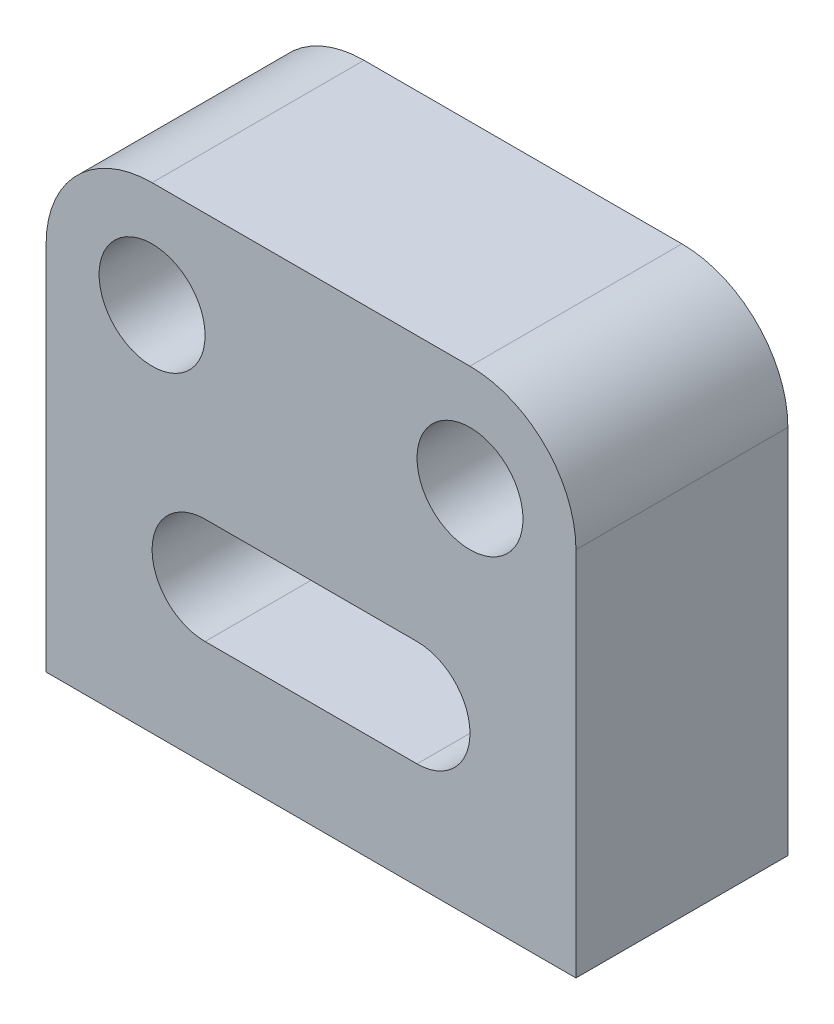
ISO-10303-21;
HEADER;
FILE_DESCRIPTION(('STEP AP214'),'2;1');
FILE_NAME('part.step','',(''),(''),'','','');
FILE_SCHEMA(('AUTOMOTIVE_DESIGN { 1 0 10303 214 1 1 1 1 }'));
ENDSEC;
DATA;
#1=APPLICATION_CONTEXT('core data for automotive mechanical design processes');
#2=APPLICATION_PROTOCOL_DEFINITION('international standard','automotive_design',2000,#1);
#3=PRODUCT_CONTEXT('',#1,'mechanical');
#4=PRODUCT('Part','Part','',(#3));
#5=PRODUCT_RELATED_PRODUCT_CATEGORY('part','',(#4));
#6=PRODUCT_DEFINITION_FORMATION('','',#4);
#7=PRODUCT_DEFINITION_CONTEXT('part definition',#1,'design');
#8=PRODUCT_DEFINITION('design','',#6,#7);
#9=PRODUCT_DEFINITION_SHAPE('','',#8);
#10=(LENGTH_UNIT() NAMED_UNIT(*) SI_UNIT(.MILLI.,.METRE.));
#11=(NAMED_UNIT(*) PLANE_ANGLE_UNIT() SI_UNIT($,.RADIAN.));
#12=(NAMED_UNIT(*) SI_UNIT($,.STERADIAN.) SOLID_ANGLE_UNIT());
#13=UNCERTAINTY_MEASURE_WITH_UNIT(LENGTH_MEASURE(1.E-05),#10,'distance_accuracy_value','');
#14=(GEOMETRIC_REPRESENTATION_CONTEXT(3) GLOBAL_UNCERTAINTY_ASSIGNED_CONTEXT((#13)) GLOBAL_UNIT_ASSIGNED_CONTEXT((#10,
#11,#12)) REPRESENTATION_CONTEXT('',''));
#15=CARTESIAN_POINT('',(0.,0.,0.));
#16=DIRECTION('',(0.,0.,1.));
#17=DIRECTION('',(1.,0.,0.));
#18=AXIS2_PLACEMENT_3D('',#15,#16,#17);
#19=CARTESIAN_POINT('',(-30.,70.,40.));
#20=DIRECTION('',(0.,0.,-1.));
#21=DIRECTION('',(-1.,0.,0.));
#22=AXIS2_PLACEMENT_3D('',#19,#20,#21);
#23=PLANE('',#22);
#24=CARTESIAN_POINT('',(30.,69.9999999999999,40.));
#25=DIRECTION('',(0.,0.,1.));
#26=DIRECTION('',(-1.,0.,0.));
#27=AXIS2_PLACEMENT_3D('',#24,#25,#26);
#28=CIRCLE('',#27,10.);
#29=CARTESIAN_POINT('',(20.,69.9999999999999,40.));
#30=VERTEX_POINT('',#29);
#31=EDGE_CURVE('E152',#30,#30,#28,.T.);
#32=ORIENTED_EDGE('',*,*,#31,.F.);
#33=EDGE_LOOP('',(#32));
#34=FACE_BOUND('',#33,.T.);
#35=CARTESIAN_POINT('',(-30.,70.,40.));
#36=DIRECTION('',(0.,0.,1.));
#37=DIRECTION('',(1.,0.,0.));
#38=AXIS2_PLACEMENT_3D('',#35,#36,#37);
#39=CIRCLE('',#38,10.);
#40=CARTESIAN_POINT('',(-20.,70.,40.));
#41=VERTEX_POINT('',#40);
#42=EDGE_CURVE('E158',#41,#41,#39,.T.);
#43=ORIENTED_EDGE('',*,*,#42,.F.);
#44=EDGE_LOOP('',(#43));
#45=FACE_BOUND('',#44,.T.);
#46=DIRECTION('',(0.,-1.,0.));
#47=VECTOR('',#46,1.);
#48=CARTESIAN_POINT('',(-50.,0.,40.));
#49=LINE('',#48,#47);
#50=CARTESIAN_POINT('',(-50.,70.,40.));
#51=VERTEX_POINT('',#50);
#52=CARTESIAN_POINT('',(-50.,0.,40.));
#53=VERTEX_POINT('',#52);
#54=EDGE_CURVE('E164',#51,#53,#49,.T.);
#55=ORIENTED_EDGE('',*,*,#54,.T.);
#56=DIRECTION('',(1.,0.,0.));
#57=VECTOR('',#56,1.);
#58=CARTESIAN_POINT('',(50.,0.,40.));
#59=LINE('',#58,#57);
#60=CARTESIAN_POINT('',(50.,0.,40.));
#61=VERTEX_POINT('',#60);
#62=EDGE_CURVE('E167',#53,#61,#59,.T.);
#63=ORIENTED_EDGE('',*,*,#62,.T.);
#64=DIRECTION('',(0.,1.,0.));
#65=VECTOR('',#64,1.);
#66=CARTESIAN_POINT('',(50.,0.,40.));
#67=LINE('',#66,#65);
#68=CARTESIAN_POINT('',(50.,69.9999999999999,40.));
#69=VERTEX_POINT('',#68);
#70=EDGE_CURVE('E170',#61,#69,#67,.T.);
#71=ORIENTED_EDGE('',*,*,#70,.T.);
#72=CARTESIAN_POINT('',(30.,69.9999999999999,40.));
#73=DIRECTION('',(0.,0.,1.));
#74=DIRECTION('',(1.,0.,0.));
#75=AXIS2_PLACEMENT_3D('',#72,#73,#74);
#76=CIRCLE('',#75,20.);
#77=CARTESIAN_POINT('',(30.,89.9999999999999,40.));
#78=VERTEX_POINT('',#77);
#79=EDGE_CURVE('E172',#69,#78,#76,.T.);
#80=ORIENTED_EDGE('',*,*,#79,.T.);
#81=DIRECTION('',(-1.,0.,0.));
#82=VECTOR('',#81,1.);
#83=CARTESIAN_POINT('',(-30.,90.,40.));
#84=LINE('',#83,#82);
#85=CARTESIAN_POINT('',(-30.,90.,40.));
#86=VERTEX_POINT('',#85);
#87=EDGE_CURVE('E174',#78,#86,#84,.T.);
#88=ORIENTED_EDGE('',*,*,#87,.T.);
#89=CARTESIAN_POINT('',(-30.,70.,40.));
#90=DIRECTION('',(0.,0.,1.));
#91=DIRECTION('',(-1.,0.,0.));
#92=AXIS2_PLACEMENT_3D('',#89,#90,#91);
#93=CIRCLE('',#92,20.);
#94=EDGE_CURVE('E176',#86,#51,#93,.T.);
#95=ORIENTED_EDGE('',*,*,#94,.T.);
#96=EDGE_LOOP('',(#55,#63,#71,#80,#88,#95));
#97=FACE_BOUND('',#96,.T.);
#98=CARTESIAN_POINT('',(-20.,30.,40.));
#99=DIRECTION('',(0.,0.,1.));
#100=DIRECTION('',(1.,0.,0.));
#101=AXIS2_PLACEMENT_3D('',#98,#99,#100);
#102=CIRCLE('',#101,10.);
#103=CARTESIAN_POINT('',(-20.,40.,40.));
#104=VERTEX_POINT('',#103);
#105=CARTESIAN_POINT('',(-20.,20.,40.));
#106=VERTEX_POINT('',#105);
#107=EDGE_CURVE('E116',#104,#106,#102,.T.);
#108=ORIENTED_EDGE('',*,*,#107,.F.);
#109=DIRECTION('',(-1.,0.,0.));
#110=VECTOR('',#109,1.);
#111=CARTESIAN_POINT('',(-20.,40.,40.));
#112=LINE('',#111,#110);
#113=CARTESIAN_POINT('',(20.,40.,40.));
#114=VERTEX_POINT('',#113);
#115=EDGE_CURVE('E138',#114,#104,#112,.T.);
#116=ORIENTED_EDGE('',*,*,#115,.F.);
#117=CARTESIAN_POINT('',(20.,30.,40.));
#118=DIRECTION('',(0.,0.,1.));
#119=DIRECTION('',(1.,0.,0.));
#120=AXIS2_PLACEMENT_3D('',#117,#118,#119);
#121=CIRCLE('',#120,10.);
#122=CARTESIAN_POINT('',(20.,20.,40.));
#123=VERTEX_POINT('',#122);
#124=EDGE_CURVE('E136',#123,#114,#121,.T.);
#125=ORIENTED_EDGE('',*,*,#124,.F.);
#126=DIRECTION('',(1.,0.,0.));
#127=VECTOR('',#126,1.);
#128=CARTESIAN_POINT('',(-20.,20.,40.));
#129=LINE('',#128,#127);
#130=EDGE_CURVE('E124',#106,#123,#129,.T.);
#131=ORIENTED_EDGE('',*,*,#130,.F.);
#132=EDGE_LOOP('',(#108,#116,#125,#131));
#133=FACE_BOUND('',#132,.T.);
#134=ADVANCED_FACE('F39',(#34,#45,#97,#133),#23,.F.);
#135=CARTESIAN_POINT('',(-30.,70.,0.));
#136=DIRECTION('',(0.,0.,-1.));
#137=DIRECTION('',(-1.,0.,0.));
#138=AXIS2_PLACEMENT_3D('',#135,#136,#137);
#139=PLANE('',#138);
#140=CARTESIAN_POINT('',(-30.,70.,0.));
#141=DIRECTION('',(0.,0.,1.));
#142=DIRECTION('',(1.,0.,0.));
#143=AXIS2_PLACEMENT_3D('',#140,#141,#142);
#144=CIRCLE('',#143,10.);
#145=CARTESIAN_POINT('',(-20.,70.,0.));
#146=VERTEX_POINT('',#145);
#147=EDGE_CURVE('E155',#146,#146,#144,.T.);
#148=ORIENTED_EDGE('',*,*,#147,.T.);
#149=EDGE_LOOP('',(#148));
#150=FACE_BOUND('',#149,.T.);
#151=DIRECTION('',(0.,-1.,0.));
#152=VECTOR('',#151,1.);
#153=CARTESIAN_POINT('',(-50.,0.,0.));
#154=LINE('',#153,#152);
#155=CARTESIAN_POINT('',(-50.,70.,0.));
#156=VERTEX_POINT('',#155);
#157=CARTESIAN_POINT('',(-50.,0.,0.));
#158=VERTEX_POINT('',#157);
#159=EDGE_CURVE('E161',#156,#158,#154,.T.);
#160=ORIENTED_EDGE('',*,*,#159,.F.);
#161=CARTESIAN_POINT('',(-30.,70.,0.));
#162=DIRECTION('',(0.,0.,1.));
#163=DIRECTION('',(-1.,0.,0.));
#164=AXIS2_PLACEMENT_3D('',#161,#162,#163);
#165=CIRCLE('',#164,20.);
#166=CARTESIAN_POINT('',(-30.,90.,0.));
#167=VERTEX_POINT('',#166);
#168=EDGE_CURVE('E168',#167,#156,#165,.T.);
#169=ORIENTED_EDGE('',*,*,#168,.F.);
#170=DIRECTION('',(-1.,0.,0.));
#171=VECTOR('',#170,1.);
#172=CARTESIAN_POINT('',(-30.,90.,0.));
#173=LINE('',#172,#171);
#174=CARTESIAN_POINT('',(30.,89.9999999999999,0.));
#175=VERTEX_POINT('',#174);
#176=EDGE_CURVE('E187',#175,#167,#173,.T.);
#177=ORIENTED_EDGE('',*,*,#176,.F.);
#178=CARTESIAN_POINT('',(30.,69.9999999999999,0.));
#179=DIRECTION('',(0.,0.,1.));
#180=DIRECTION('',(1.,0.,0.));
#181=AXIS2_PLACEMENT_3D('',#178,#179,#180);
#182=CIRCLE('',#181,20.);
#183=CARTESIAN_POINT('',(50.,69.9999999999999,0.));
#184=VERTEX_POINT('',#183);
#185=EDGE_CURVE('E185',#184,#175,#182,.T.);
#186=ORIENTED_EDGE('',*,*,#185,.F.);
#187=DIRECTION('',(0.,1.,0.));
#188=VECTOR('',#187,1.);
#189=CARTESIAN_POINT('',(50.,0.,0.));
#190=LINE('',#189,#188);
#191=CARTESIAN_POINT('',(50.,0.,0.));
#192=VERTEX_POINT('',#191);
#193=EDGE_CURVE('E183',#192,#184,#190,.T.);
#194=ORIENTED_EDGE('',*,*,#193,.F.);
#195=DIRECTION('',(1.,0.,0.));
#196=VECTOR('',#195,1.);
#197=CARTESIAN_POINT('',(50.,0.,0.));
#198=LINE('',#197,#196);
#199=EDGE_CURVE('E181',#158,#192,#198,.T.);
#200=ORIENTED_EDGE('',*,*,#199,.F.);
#201=EDGE_LOOP('',(#160,#169,#177,#186,#194,#200));
#202=FACE_BOUND('',#201,.T.);
#203=CARTESIAN_POINT('',(30.,69.9999999999999,0.));
#204=DIRECTION('',(0.,0.,1.));
#205=DIRECTION('',(-1.,0.,0.));
#206=AXIS2_PLACEMENT_3D('',#203,#204,#205);
#207=CIRCLE('',#206,10.);
#208=CARTESIAN_POINT('',(20.,69.9999999999999,0.));
#209=VERTEX_POINT('',#208);
#210=EDGE_CURVE('E132',#209,#209,#207,.T.);
#211=ORIENTED_EDGE('',*,*,#210,.T.);
#212=EDGE_LOOP('',(#211));
#213=FACE_BOUND('',#212,.T.);
#214=DIRECTION('',(-1.,0.,0.));
#215=VECTOR('',#214,1.);
#216=CARTESIAN_POINT('',(-20.,40.,0.));
#217=LINE('',#216,#215);
#218=CARTESIAN_POINT('',(20.,40.,0.));
#219=VERTEX_POINT('',#218);
#220=CARTESIAN_POINT('',(-20.,40.,0.));
#221=VERTEX_POINT('',#220);
#222=EDGE_CURVE('E125',#219,#221,#217,.T.);
#223=ORIENTED_EDGE('',*,*,#222,.T.);
#224=CARTESIAN_POINT('',(-20.,30.,0.));
#225=DIRECTION('',(0.,0.,1.));
#226=DIRECTION('',(1.,0.,0.));
#227=AXIS2_PLACEMENT_3D('',#224,#225,#226);
#228=CIRCLE('',#227,10.);
#229=CARTESIAN_POINT('',(-20.,20.,0.));
#230=VERTEX_POINT('',#229);
#231=EDGE_CURVE('E62',#221,#230,#228,.T.);
#232=ORIENTED_EDGE('',*,*,#231,.T.);
#233=DIRECTION('',(1.,0.,0.));
#234=VECTOR('',#233,1.);
#235=CARTESIAN_POINT('',(-20.,20.,0.));
#236=LINE('',#235,#234);
#237=CARTESIAN_POINT('',(20.,20.,0.));
#238=VERTEX_POINT('',#237);
#239=EDGE_CURVE('E131',#230,#238,#236,.T.);
#240=ORIENTED_EDGE('',*,*,#239,.T.);
#241=CARTESIAN_POINT('',(20.,30.,0.));
#242=DIRECTION('',(0.,0.,1.));
#243=DIRECTION('',(1.,0.,0.));
#244=AXIS2_PLACEMENT_3D('',#241,#242,#243);
#245=CIRCLE('',#244,10.);
#246=EDGE_CURVE('E144',#238,#219,#245,.T.);
#247=ORIENTED_EDGE('',*,*,#246,.T.);
#248=EDGE_LOOP('',(#223,#232,#240,#247));
#249=FACE_BOUND('',#248,.T.);
#250=ADVANCED_FACE('F211',(#150,#202,#213,#249),#139,.T.);
#251=CARTESIAN_POINT('',(-50.,0.,40.));
#252=DIRECTION('',(1.,0.,0.));
#253=DIRECTION('',(0.,0.,-1.));
#254=AXIS2_PLACEMENT_3D('',#251,#252,#253);
#255=PLANE('',#254);
#256=ORIENTED_EDGE('',*,*,#159,.T.);
#257=DIRECTION('',(0.,0.,-1.));
#258=VECTOR('',#257,1.);
#259=CARTESIAN_POINT('',(-50.,0.,40.));
#260=LINE('',#259,#258);
#261=EDGE_CURVE('E11',#53,#158,#260,.T.);
#262=ORIENTED_EDGE('',*,*,#261,.F.);
#263=ORIENTED_EDGE('',*,*,#54,.F.);
#264=DIRECTION('',(0.,0.,-1.));
#265=VECTOR('',#264,1.);
#266=CARTESIAN_POINT('',(-50.,70.,40.));
#267=LINE('',#266,#265);
#268=EDGE_CURVE('E178',#51,#156,#267,.T.);
#269=ORIENTED_EDGE('',*,*,#268,.T.);
#270=EDGE_LOOP('',(#256,#262,#263,#269));
#271=FACE_BOUND('',#270,.T.);
#272=ADVANCED_FACE('F41',(#271),#255,.F.);
#273=CARTESIAN_POINT('',(50.,0.,40.));
#274=DIRECTION('',(0.,1.,0.));
#275=DIRECTION('',(-1.,0.,0.));
#276=AXIS2_PLACEMENT_3D('',#273,#274,#275);
#277=PLANE('',#276);
#278=ORIENTED_EDGE('',*,*,#199,.T.);
#279=DIRECTION('',(0.,0.,-1.));
#280=VECTOR('',#279,1.);
#281=CARTESIAN_POINT('',(50.,0.,40.));
#282=LINE('',#281,#280);
#283=EDGE_CURVE('E47',#61,#192,#282,.T.);
#284=ORIENTED_EDGE('',*,*,#283,.F.);
#285=ORIENTED_EDGE('',*,*,#62,.F.);
#286=ORIENTED_EDGE('',*,*,#261,.T.);
#287=EDGE_LOOP('',(#278,#284,#285,#286));
#288=FACE_BOUND('',#287,.T.);
#289=ADVANCED_FACE('F228',(#288),#277,.F.);
#290=CARTESIAN_POINT('',(50.,0.,40.));
#291=DIRECTION('',(-1.,0.,0.));
#292=DIRECTION('',(0.,0.,1.));
#293=AXIS2_PLACEMENT_3D('',#290,#291,#292);
#294=PLANE('',#293);
#295=ORIENTED_EDGE('',*,*,#193,.T.);
#296=DIRECTION('',(0.,0.,-1.));
#297=VECTOR('',#296,1.);
#298=CARTESIAN_POINT('',(50.,69.9999999999999,40.));
#299=LINE('',#298,#297);
#300=EDGE_CURVE('E198',#69,#184,#299,.T.);
#301=ORIENTED_EDGE('',*,*,#300,.F.);
#302=ORIENTED_EDGE('',*,*,#70,.F.);
#303=ORIENTED_EDGE('',*,*,#283,.T.);
#304=EDGE_LOOP('',(#295,#301,#302,#303));
#305=FACE_BOUND('',#304,.T.);
#306=ADVANCED_FACE('F205',(#305),#294,.F.);
#307=CARTESIAN_POINT('',(30.,69.9999999999999,40.));
#308=DIRECTION('',(0.,0.,-1.));
#309=DIRECTION('',(-1.,0.,0.));
#310=AXIS2_PLACEMENT_3D('',#307,#308,#309);
#311=CYLINDRICAL_SURFACE('',#310,20.);
#312=ORIENTED_EDGE('',*,*,#185,.T.);
#313=DIRECTION('',(0.,0.,-1.));
#314=VECTOR('',#313,1.);
#315=CARTESIAN_POINT('',(30.,89.9999999999999,40.));
#316=LINE('',#315,#314);
#317=EDGE_CURVE('E195',#78,#175,#316,.T.);
#318=ORIENTED_EDGE('',*,*,#317,.F.);
#319=ORIENTED_EDGE('',*,*,#79,.F.);
#320=ORIENTED_EDGE('',*,*,#300,.T.);
#321=EDGE_LOOP('',(#312,#318,#319,#320));
#322=FACE_BOUND('',#321,.T.);
#323=ADVANCED_FACE('F217',(#322),#311,.T.);
#324=CARTESIAN_POINT('',(-30.,90.,40.));
#325=DIRECTION('',(0.,-1.,0.));
#326=DIRECTION('',(1.,0.,0.));
#327=AXIS2_PLACEMENT_3D('',#324,#325,#326);
#328=PLANE('',#327);
#329=ORIENTED_EDGE('',*,*,#176,.T.);
#330=DIRECTION('',(0.,0.,-1.));
#331=VECTOR('',#330,1.);
#332=CARTESIAN_POINT('',(-30.,90.,40.));
#333=LINE('',#332,#331);
#334=EDGE_CURVE('E192',#86,#167,#333,.T.);
#335=ORIENTED_EDGE('',*,*,#334,.F.);
#336=ORIENTED_EDGE('',*,*,#87,.F.);
#337=ORIENTED_EDGE('',*,*,#317,.T.);
#338=EDGE_LOOP('',(#329,#335,#336,#337));
#339=FACE_BOUND('',#338,.T.);
#340=ADVANCED_FACE('F221',(#339),#328,.F.);
#341=CARTESIAN_POINT('',(-30.,70.,40.));
#342=DIRECTION('',(0.,0.,-1.));
#343=DIRECTION('',(-1.,0.,0.));
#344=AXIS2_PLACEMENT_3D('',#341,#342,#343);
#345=CYLINDRICAL_SURFACE('',#344,20.);
#346=ORIENTED_EDGE('',*,*,#168,.T.);
#347=ORIENTED_EDGE('',*,*,#268,.F.);
#348=ORIENTED_EDGE('',*,*,#94,.F.);
#349=ORIENTED_EDGE('',*,*,#334,.T.);
#350=EDGE_LOOP('',(#346,#347,#348,#349));
#351=FACE_BOUND('',#350,.T.);
#352=ADVANCED_FACE('F231',(#351),#345,.T.);
#353=CARTESIAN_POINT('',(-30.,70.,40.));
#354=DIRECTION('',(0.,0.,-1.));
#355=DIRECTION('',(-1.,0.,0.));
#356=AXIS2_PLACEMENT_3D('',#353,#354,#355);
#357=CYLINDRICAL_SURFACE('',#356,10.);
#358=ORIENTED_EDGE('',*,*,#42,.T.);
#359=EDGE_LOOP('',(#358));
#360=FACE_BOUND('',#359,.T.);
#361=ORIENTED_EDGE('',*,*,#147,.F.);
#362=EDGE_LOOP('',(#361));
#363=FACE_BOUND('',#362,.T.);
#364=ADVANCED_FACE('F233',(#360,#363),#357,.F.);
#365=CARTESIAN_POINT('',(30.,69.9999999999999,40.));
#366=DIRECTION('',(0.,0.,-1.));
#367=DIRECTION('',(-1.,0.,0.));
#368=AXIS2_PLACEMENT_3D('',#365,#366,#367);
#369=CYLINDRICAL_SURFACE('',#368,10.);
#370=ORIENTED_EDGE('',*,*,#31,.T.);
#371=EDGE_LOOP('',(#370));
#372=FACE_BOUND('',#371,.T.);
#373=ORIENTED_EDGE('',*,*,#210,.F.);
#374=EDGE_LOOP('',(#373));
#375=FACE_BOUND('',#374,.T.);
#376=ADVANCED_FACE('F239',(#372,#375),#369,.F.);
#377=CARTESIAN_POINT('',(-20.,30.,40.));
#378=DIRECTION('',(0.,0.,-1.));
#379=DIRECTION('',(-1.,0.,0.));
#380=AXIS2_PLACEMENT_3D('',#377,#378,#379);
#381=CYLINDRICAL_SURFACE('',#380,10.);
#382=ORIENTED_EDGE('',*,*,#231,.F.);
#383=DIRECTION('',(0.,0.,-1.));
#384=VECTOR('',#383,1.);
#385=CARTESIAN_POINT('',(-20.,40.,40.));
#386=LINE('',#385,#384);
#387=EDGE_CURVE('E120',#104,#221,#386,.T.);
#388=ORIENTED_EDGE('',*,*,#387,.F.);
#389=ORIENTED_EDGE('',*,*,#107,.T.);
#390=DIRECTION('',(0.,0.,-1.));
#391=VECTOR('',#390,1.);
#392=CARTESIAN_POINT('',(-20.,20.,40.));
#393=LINE('',#392,#391);
#394=EDGE_CURVE('E119',#106,#230,#393,.T.);
#395=ORIENTED_EDGE('',*,*,#394,.T.);
#396=EDGE_LOOP('',(#382,#388,#389,#395));
#397=FACE_BOUND('',#396,.T.);
#398=ADVANCED_FACE('F118',(#397),#381,.F.);
#399=CARTESIAN_POINT('',(-20.,20.,40.));
#400=DIRECTION('',(0.,1.,0.));
#401=DIRECTION('',(0.,0.,1.));
#402=AXIS2_PLACEMENT_3D('',#399,#400,#401);
#403=PLANE('',#402);
#404=ORIENTED_EDGE('',*,*,#239,.F.);
#405=ORIENTED_EDGE('',*,*,#394,.F.);
#406=ORIENTED_EDGE('',*,*,#130,.T.);
#407=DIRECTION('',(0.,0.,-1.));
#408=VECTOR('',#407,1.);
#409=CARTESIAN_POINT('',(20.,20.,40.));
#410=LINE('',#409,#408);
#411=EDGE_CURVE('E133',#123,#238,#410,.T.);
#412=ORIENTED_EDGE('',*,*,#411,.T.);
#413=EDGE_LOOP('',(#404,#405,#406,#412));
#414=FACE_BOUND('',#413,.T.);
#415=ADVANCED_FACE('F128',(#414),#403,.T.);
#416=CARTESIAN_POINT('',(20.,30.,40.));
#417=DIRECTION('',(0.,0.,-1.));
#418=DIRECTION('',(-1.,0.,0.));
#419=AXIS2_PLACEMENT_3D('',#416,#417,#418);
#420=CYLINDRICAL_SURFACE('',#419,10.);
#421=ORIENTED_EDGE('',*,*,#246,.F.);
#422=ORIENTED_EDGE('',*,*,#411,.F.);
#423=ORIENTED_EDGE('',*,*,#124,.T.);
#424=DIRECTION('',(0.,0.,-1.));
#425=VECTOR('',#424,1.);
#426=CARTESIAN_POINT('',(20.,40.,40.));
#427=LINE('',#426,#425);
#428=EDGE_CURVE('E54',#114,#219,#427,.T.);
#429=ORIENTED_EDGE('',*,*,#428,.T.);
#430=EDGE_LOOP('',(#421,#422,#423,#429));
#431=FACE_BOUND('',#430,.T.);
#432=ADVANCED_FACE('F261',(#431),#420,.F.);
#433=CARTESIAN_POINT('',(-20.,40.,40.));
#434=DIRECTION('',(0.,-1.,0.));
#435=DIRECTION('',(0.,0.,-1.));
#436=AXIS2_PLACEMENT_3D('',#433,#434,#435);
#437=PLANE('',#436);
#438=ORIENTED_EDGE('',*,*,#222,.F.);
#439=ORIENTED_EDGE('',*,*,#428,.F.);
#440=ORIENTED_EDGE('',*,*,#115,.T.);
#441=ORIENTED_EDGE('',*,*,#387,.T.);
#442=EDGE_LOOP('',(#438,#439,#440,#441));
#443=FACE_BOUND('',#442,.T.);
#444=ADVANCED_FACE('F264',(#443),#437,.T.);
#445=CLOSED_SHELL('',(#134,#250,#272,#289,#306,#323,#340,#352,#364,#376,#398,#415,#432,#444));
#446=MANIFOLD_SOLID_BREP('B2',#445);
#447=ADVANCED_BREP_SHAPE_REPRESENTATION('',(#18,#446),#14);
#448=SHAPE_DEFINITION_REPRESENTATION(#9,#447);
ENDSEC;
END-ISO-10303-21;
